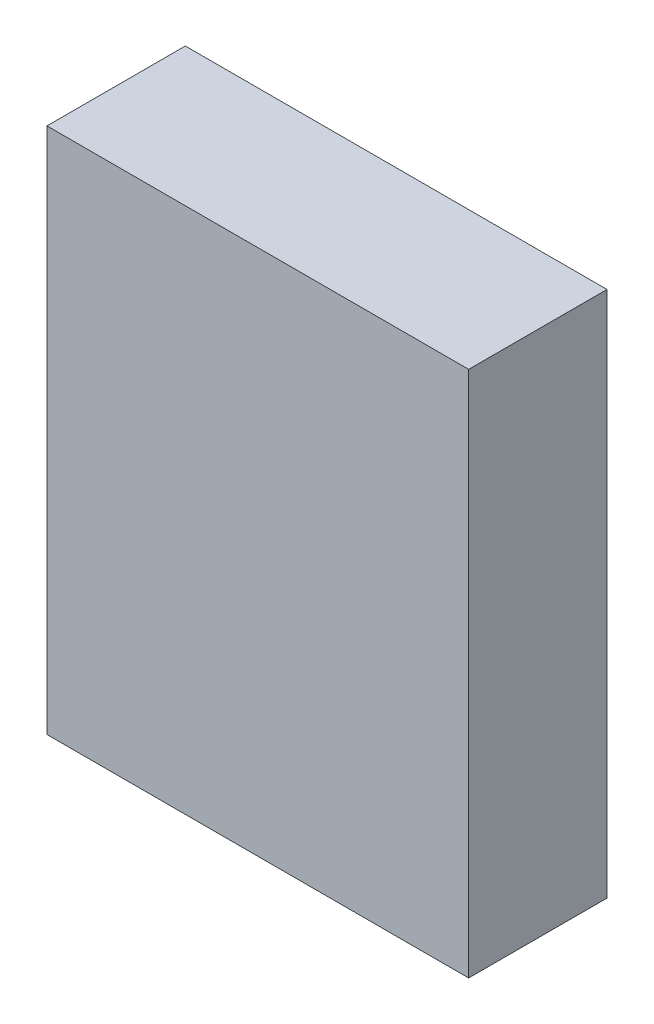
ISO-10303-21;
HEADER;
FILE_DESCRIPTION(('STEP AP214'),'2;1');
FILE_NAME('part.step','',(''),(''),'','','');
FILE_SCHEMA(('AUTOMOTIVE_DESIGN { 1 0 10303 214 1 1 1 1 }'));
ENDSEC;
DATA;
#1=APPLICATION_CONTEXT('core data for automotive mechanical design processes');
#2=APPLICATION_PROTOCOL_DEFINITION('international standard','automotive_design',2000,#1);
#3=PRODUCT_CONTEXT('',#1,'mechanical');
#4=PRODUCT('Part','Part','',(#3));
#5=PRODUCT_RELATED_PRODUCT_CATEGORY('part','',(#4));
#6=PRODUCT_DEFINITION_FORMATION('','',#4);
#7=PRODUCT_DEFINITION_CONTEXT('part definition',#1,'design');
#8=PRODUCT_DEFINITION('design','',#6,#7);
#9=PRODUCT_DEFINITION_SHAPE('','',#8);
#10=(LENGTH_UNIT() NAMED_UNIT(*) SI_UNIT(.MILLI.,.METRE.));
#11=(NAMED_UNIT(*) PLANE_ANGLE_UNIT() SI_UNIT($,.RADIAN.));
#12=(NAMED_UNIT(*) SI_UNIT($,.STERADIAN.) SOLID_ANGLE_UNIT());
#13=UNCERTAINTY_MEASURE_WITH_UNIT(LENGTH_MEASURE(1.E-05),#10,'distance_accuracy_value','');
#14=(GEOMETRIC_REPRESENTATION_CONTEXT(3) GLOBAL_UNCERTAINTY_ASSIGNED_CONTEXT((#13)) GLOBAL_UNIT_ASSIGNED_CONTEXT((#10,
#11,#12)) REPRESENTATION_CONTEXT('',''));
#15=CARTESIAN_POINT('',(0.,0.,0.));
#16=DIRECTION('',(0.,0.,1.));
#17=DIRECTION('',(1.,0.,0.));
#18=AXIS2_PLACEMENT_3D('',#15,#16,#17);
#19=CARTESIAN_POINT('',(-0.80000094,1.00000054,0.52500022));
#20=DIRECTION('',(0.,0.,1.));
#21=DIRECTION('',(1.,0.,0.));
#22=AXIS2_PLACEMENT_3D('',#19,#20,#21);
#23=PLANE('',#22);
#24=DIRECTION('',(0.,1.,0.));
#25=VECTOR('',#24,1.);
#26=CARTESIAN_POINT('',(0.80000094,1.00000054,0.52500022));
#27=LINE('',#26,#25);
#28=CARTESIAN_POINT('',(0.80000094,1.00000054,0.52500022));
#29=VERTEX_POINT('',#28);
#30=CARTESIAN_POINT('',(0.80000094,-1.00000054,0.52500022));
#31=VERTEX_POINT('',#30);
#32=EDGE_CURVE('E53',#29,#31,#27,.F.);
#33=ORIENTED_EDGE('',*,*,#32,.F.);
#34=DIRECTION('',(1.,0.,0.));
#35=VECTOR('',#34,1.);
#36=CARTESIAN_POINT('',(-0.80000094,1.00000054,0.52500022));
#37=LINE('',#36,#35);
#38=CARTESIAN_POINT('',(-0.80000094,1.00000054,0.52500022));
#39=VERTEX_POINT('',#38);
#40=EDGE_CURVE('E20',#29,#39,#37,.F.);
#41=ORIENTED_EDGE('',*,*,#40,.T.);
#42=DIRECTION('',(0.,1.,0.));
#43=VECTOR('',#42,1.);
#44=CARTESIAN_POINT('',(-0.80000094,-1.00000054,0.52500022));
#45=LINE('',#44,#43);
#46=CARTESIAN_POINT('',(-0.80000094,-1.00000054,0.52500022));
#47=VERTEX_POINT('',#46);
#48=EDGE_CURVE('E67',#47,#39,#45,.T.);
#49=ORIENTED_EDGE('',*,*,#48,.F.);
#50=DIRECTION('',(1.,0.,0.));
#51=VECTOR('',#50,1.);
#52=CARTESIAN_POINT('',(0.80000094,-1.00000054,0.52500022));
#53=LINE('',#52,#51);
#54=EDGE_CURVE('E58',#31,#47,#53,.F.);
#55=ORIENTED_EDGE('',*,*,#54,.F.);
#56=EDGE_LOOP('',(#33,#41,#49,#55));
#57=FACE_BOUND('',#56,.T.);
#58=ADVANCED_FACE('F17',(#57),#23,.T.);
#59=CARTESIAN_POINT('',(-0.80000094,-1.00000054,0.));
#60=DIRECTION('',(-1.,0.,0.));
#61=DIRECTION('',(0.,0.,1.));
#62=AXIS2_PLACEMENT_3D('',#59,#60,#61);
#63=PLANE('',#62);
#64=DIRECTION('',(0.,0.,1.));
#65=VECTOR('',#64,1.);
#66=CARTESIAN_POINT('',(-0.80000094,1.00000054,0.));
#67=LINE('',#66,#65);
#68=CARTESIAN_POINT('',(-0.80000094,1.00000054,0.));
#69=VERTEX_POINT('',#68);
#70=EDGE_CURVE('E80',#69,#39,#67,.T.);
#71=ORIENTED_EDGE('',*,*,#70,.F.);
#72=DIRECTION('',(0.,1.,0.));
#73=VECTOR('',#72,1.);
#74=CARTESIAN_POINT('',(-0.80000094,1.00000054,0.));
#75=LINE('',#74,#73);
#76=CARTESIAN_POINT('',(-0.80000094,-1.00000054,0.));
#77=VERTEX_POINT('',#76);
#78=EDGE_CURVE('E75',#69,#77,#75,.F.);
#79=ORIENTED_EDGE('',*,*,#78,.T.);
#80=DIRECTION('',(0.,0.,-1.));
#81=VECTOR('',#80,1.);
#82=CARTESIAN_POINT('',(-0.80000094,-1.00000054,0.));
#83=LINE('',#82,#81);
#84=EDGE_CURVE('E63',#47,#77,#83,.T.);
#85=ORIENTED_EDGE('',*,*,#84,.F.);
#86=ORIENTED_EDGE('',*,*,#48,.T.);
#87=EDGE_LOOP('',(#71,#79,#85,#86));
#88=FACE_BOUND('',#87,.T.);
#89=ADVANCED_FACE('F74',(#88),#63,.T.);
#90=CARTESIAN_POINT('',(0.80000094,-1.00000054,0.));
#91=DIRECTION('',(0.,-1.,0.));
#92=DIRECTION('',(0.,0.,-1.));
#93=AXIS2_PLACEMENT_3D('',#90,#91,#92);
#94=PLANE('',#93);
#95=ORIENTED_EDGE('',*,*,#84,.T.);
#96=DIRECTION('',(1.,0.,0.));
#97=VECTOR('',#96,1.);
#98=CARTESIAN_POINT('',(-0.80000094,-1.00000054,0.));
#99=LINE('',#98,#97);
#100=CARTESIAN_POINT('',(0.80000094,-1.00000054,0.));
#101=VERTEX_POINT('',#100);
#102=EDGE_CURVE('E84',#77,#101,#99,.T.);
#103=ORIENTED_EDGE('',*,*,#102,.T.);
#104=DIRECTION('',(0.,0.,-1.));
#105=VECTOR('',#104,1.);
#106=CARTESIAN_POINT('',(0.80000094,-1.00000054,0.));
#107=LINE('',#106,#105);
#108=EDGE_CURVE('E65',#31,#101,#107,.T.);
#109=ORIENTED_EDGE('',*,*,#108,.F.);
#110=ORIENTED_EDGE('',*,*,#54,.T.);
#111=EDGE_LOOP('',(#95,#103,#109,#110));
#112=FACE_BOUND('',#111,.T.);
#113=ADVANCED_FACE('F60',(#112),#94,.T.);
#114=CARTESIAN_POINT('',(0.80000094,1.00000054,0.));
#115=DIRECTION('',(1.,0.,0.));
#116=DIRECTION('',(0.,0.,-1.));
#117=AXIS2_PLACEMENT_3D('',#114,#115,#116);
#118=PLANE('',#117);
#119=ORIENTED_EDGE('',*,*,#108,.T.);
#120=DIRECTION('',(0.,1.,0.));
#121=VECTOR('',#120,1.);
#122=CARTESIAN_POINT('',(0.80000094,1.00000054,0.));
#123=LINE('',#122,#121);
#124=CARTESIAN_POINT('',(0.80000094,1.00000054,0.));
#125=VERTEX_POINT('',#124);
#126=EDGE_CURVE('E26',#101,#125,#123,.T.);
#127=ORIENTED_EDGE('',*,*,#126,.T.);
#128=DIRECTION('',(0.,0.,1.));
#129=VECTOR('',#128,1.);
#130=CARTESIAN_POINT('',(0.80000094,1.00000054,0.));
#131=LINE('',#130,#129);
#132=EDGE_CURVE('E34',#29,#125,#131,.F.);
#133=ORIENTED_EDGE('',*,*,#132,.F.);
#134=ORIENTED_EDGE('',*,*,#32,.T.);
#135=EDGE_LOOP('',(#119,#127,#133,#134));
#136=FACE_BOUND('',#135,.T.);
#137=ADVANCED_FACE('F88',(#136),#118,.T.);
#138=CARTESIAN_POINT('',(-0.80000094,1.00000054,0.));
#139=DIRECTION('',(0.,1.,0.));
#140=DIRECTION('',(0.,0.,1.));
#141=AXIS2_PLACEMENT_3D('',#138,#139,#140);
#142=PLANE('',#141);
#143=ORIENTED_EDGE('',*,*,#132,.T.);
#144=DIRECTION('',(1.,0.,0.));
#145=VECTOR('',#144,1.);
#146=CARTESIAN_POINT('',(-0.80000094,1.00000054,0.));
#147=LINE('',#146,#145);
#148=EDGE_CURVE('E11',#125,#69,#147,.F.);
#149=ORIENTED_EDGE('',*,*,#148,.T.);
#150=ORIENTED_EDGE('',*,*,#70,.T.);
#151=ORIENTED_EDGE('',*,*,#40,.F.);
#152=EDGE_LOOP('',(#143,#149,#150,#151));
#153=FACE_BOUND('',#152,.T.);
#154=ADVANCED_FACE('F91',(#153),#142,.T.);
#155=CARTESIAN_POINT('',(-0.80000094,1.00000054,0.));
#156=DIRECTION('',(0.,0.,1.));
#157=DIRECTION('',(1.,0.,0.));
#158=AXIS2_PLACEMENT_3D('',#155,#156,#157);
#159=PLANE('',#158);
#160=ORIENTED_EDGE('',*,*,#126,.F.);
#161=ORIENTED_EDGE('',*,*,#102,.F.);
#162=ORIENTED_EDGE('',*,*,#78,.F.);
#163=ORIENTED_EDGE('',*,*,#148,.F.);
#164=EDGE_LOOP('',(#160,#161,#162,#163));
#165=FACE_BOUND('',#164,.T.);
#166=ADVANCED_FACE('F90',(#165),#159,.F.);
#167=CLOSED_SHELL('',(#58,#89,#113,#137,#154,#166));
#168=MANIFOLD_SOLID_BREP('B1',#167);
#169=ADVANCED_BREP_SHAPE_REPRESENTATION('',(#18,#168),#14);
#170=SHAPE_DEFINITION_REPRESENTATION(#9,#169);
ENDSEC;
END-ISO-10303-21;
